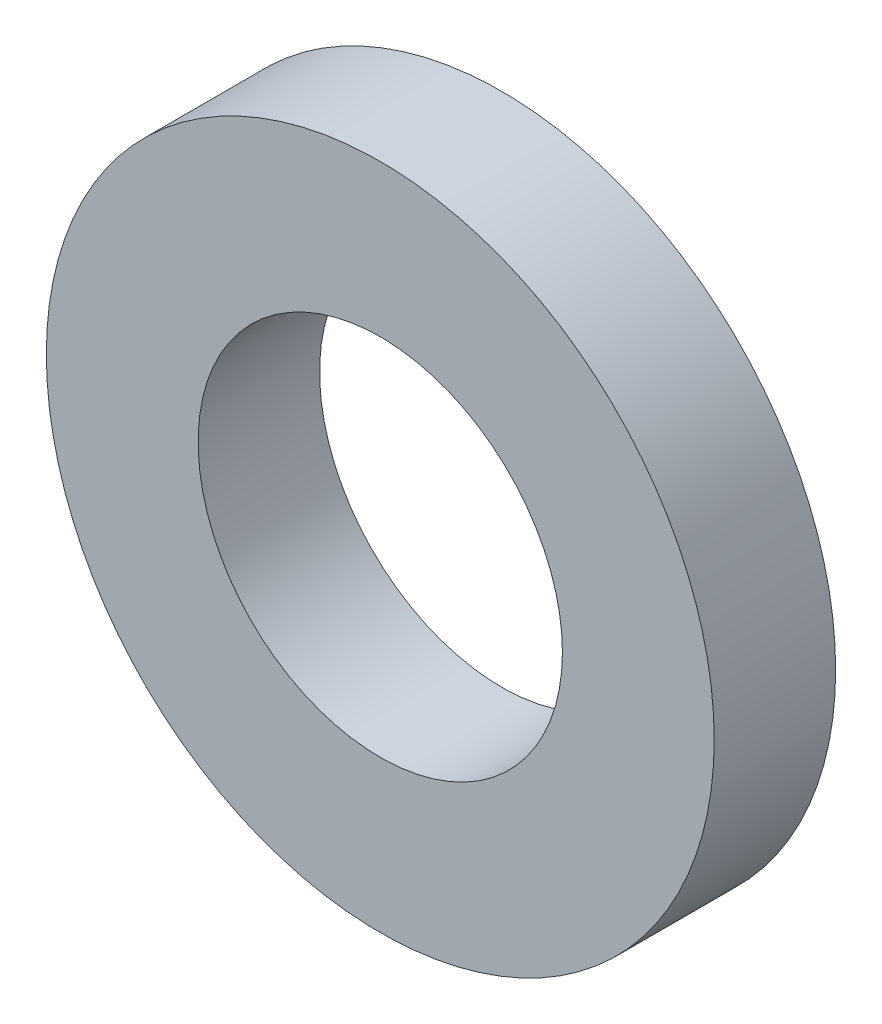
ISO-10303-21;
HEADER;
FILE_DESCRIPTION(('STEP AP214'),'2;1');
FILE_NAME('part.step','',(''),(''),'','','');
FILE_SCHEMA(('AUTOMOTIVE_DESIGN { 1 0 10303 214 1 1 1 1 }'));
ENDSEC;
DATA;
#1=APPLICATION_CONTEXT('core data for automotive mechanical design processes');
#2=APPLICATION_PROTOCOL_DEFINITION('international standard','automotive_design',2000,#1);
#3=PRODUCT_CONTEXT('',#1,'mechanical');
#4=PRODUCT('Part','Part','',(#3));
#5=PRODUCT_RELATED_PRODUCT_CATEGORY('part','',(#4));
#6=PRODUCT_DEFINITION_FORMATION('','',#4);
#7=PRODUCT_DEFINITION_CONTEXT('part definition',#1,'design');
#8=PRODUCT_DEFINITION('design','',#6,#7);
#9=PRODUCT_DEFINITION_SHAPE('','',#8);
#10=(LENGTH_UNIT() NAMED_UNIT(*) SI_UNIT(.MILLI.,.METRE.));
#11=(NAMED_UNIT(*) PLANE_ANGLE_UNIT() SI_UNIT($,.RADIAN.));
#12=(NAMED_UNIT(*) SI_UNIT($,.STERADIAN.) SOLID_ANGLE_UNIT());
#13=UNCERTAINTY_MEASURE_WITH_UNIT(LENGTH_MEASURE(1.E-05),#10,'distance_accuracy_value','');
#14=(GEOMETRIC_REPRESENTATION_CONTEXT(3) GLOBAL_UNCERTAINTY_ASSIGNED_CONTEXT((#13)) GLOBAL_UNIT_ASSIGNED_CONTEXT((#10,
#11,#12)) REPRESENTATION_CONTEXT('',''));
#15=CARTESIAN_POINT('',(0.,0.,0.));
#16=DIRECTION('',(0.,0.,1.));
#17=DIRECTION('',(1.,0.,0.));
#18=AXIS2_PLACEMENT_3D('',#15,#16,#17);
#19=CARTESIAN_POINT('',(0.,0.,10.));
#20=DIRECTION('',(0.,0.,1.));
#21=DIRECTION('',(1.,0.,0.));
#22=AXIS2_PLACEMENT_3D('',#19,#20,#21);
#23=PLANE('',#22);
#24=CARTESIAN_POINT('',(0.,0.,10.));
#25=DIRECTION('',(0.,0.,1.));
#26=DIRECTION('',(1.,0.,0.));
#27=AXIS2_PLACEMENT_3D('',#24,#25,#26);
#28=CIRCLE('',#27,27.5);
#29=CARTESIAN_POINT('',(27.5,0.,10.));
#30=VERTEX_POINT('',#29);
#31=EDGE_CURVE('E10',#30,#30,#28,.T.);
#32=ORIENTED_EDGE('',*,*,#31,.T.);
#33=EDGE_LOOP('',(#32));
#34=FACE_BOUND('',#33,.T.);
#35=CARTESIAN_POINT('',(0.,0.,10.));
#36=DIRECTION('',(0.,0.,1.));
#37=DIRECTION('',(1.,0.,0.));
#38=AXIS2_PLACEMENT_3D('',#35,#36,#37);
#39=CIRCLE('',#38,15.);
#40=CARTESIAN_POINT('',(15.,0.,10.));
#41=VERTEX_POINT('',#40);
#42=EDGE_CURVE('E41',#41,#41,#39,.T.);
#43=ORIENTED_EDGE('',*,*,#42,.F.);
#44=EDGE_LOOP('',(#43));
#45=FACE_BOUND('',#44,.T.);
#46=ADVANCED_FACE('F30',(#34,#45),#23,.T.);
#47=CARTESIAN_POINT('',(0.,0.,0.));
#48=DIRECTION('',(0.,0.,1.));
#49=DIRECTION('',(1.,0.,0.));
#50=AXIS2_PLACEMENT_3D('',#47,#48,#49);
#51=PLANE('',#50);
#52=CARTESIAN_POINT('',(0.,0.,0.));
#53=DIRECTION('',(0.,0.,1.));
#54=DIRECTION('',(1.,0.,0.));
#55=AXIS2_PLACEMENT_3D('',#52,#53,#54);
#56=CIRCLE('',#55,27.5);
#57=CARTESIAN_POINT('',(27.5,0.,0.));
#58=VERTEX_POINT('',#57);
#59=EDGE_CURVE('E34',#58,#58,#56,.T.);
#60=ORIENTED_EDGE('',*,*,#59,.F.);
#61=EDGE_LOOP('',(#60));
#62=FACE_BOUND('',#61,.T.);
#63=CARTESIAN_POINT('',(0.,0.,0.));
#64=DIRECTION('',(0.,0.,1.));
#65=DIRECTION('',(1.,0.,0.));
#66=AXIS2_PLACEMENT_3D('',#63,#64,#65);
#67=CIRCLE('',#66,15.);
#68=CARTESIAN_POINT('',(15.,0.,0.));
#69=VERTEX_POINT('',#68);
#70=EDGE_CURVE('E43',#69,#69,#67,.T.);
#71=ORIENTED_EDGE('',*,*,#70,.T.);
#72=EDGE_LOOP('',(#71));
#73=FACE_BOUND('',#72,.T.);
#74=ADVANCED_FACE('F53',(#62,#73),#51,.F.);
#75=CARTESIAN_POINT('',(0.,0.,10.));
#76=DIRECTION('',(0.,0.,-1.));
#77=DIRECTION('',(-1.,0.,0.));
#78=AXIS2_PLACEMENT_3D('',#75,#76,#77);
#79=CYLINDRICAL_SURFACE('',#78,27.5);
#80=ORIENTED_EDGE('',*,*,#31,.F.);
#81=EDGE_LOOP('',(#80));
#82=FACE_BOUND('',#81,.T.);
#83=ORIENTED_EDGE('',*,*,#59,.T.);
#84=EDGE_LOOP('',(#83));
#85=FACE_BOUND('',#84,.T.);
#86=ADVANCED_FACE('F32',(#82,#85),#79,.T.);
#87=CARTESIAN_POINT('',(0.,0.,10.));
#88=DIRECTION('',(0.,0.,-1.));
#89=DIRECTION('',(-1.,0.,0.));
#90=AXIS2_PLACEMENT_3D('',#87,#88,#89);
#91=CYLINDRICAL_SURFACE('',#90,15.);
#92=ORIENTED_EDGE('',*,*,#42,.T.);
#93=EDGE_LOOP('',(#92));
#94=FACE_BOUND('',#93,.T.);
#95=ORIENTED_EDGE('',*,*,#70,.F.);
#96=EDGE_LOOP('',(#95));
#97=FACE_BOUND('',#96,.T.);
#98=ADVANCED_FACE('F49',(#94,#97),#91,.F.);
#99=CLOSED_SHELL('',(#46,#74,#86,#98));
#100=MANIFOLD_SOLID_BREP('B2',#99);
#101=ADVANCED_BREP_SHAPE_REPRESENTATION('',(#18,#100),#14);
#102=SHAPE_DEFINITION_REPRESENTATION(#9,#101);
ENDSEC;
END-ISO-10303-21;
